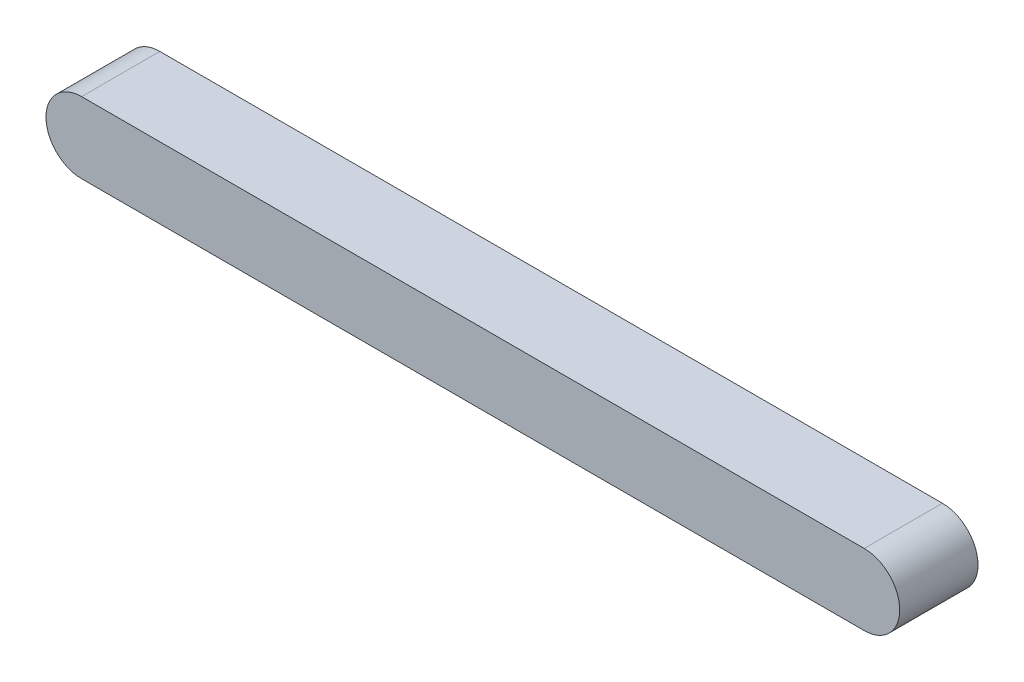
ISO-10303-21;
HEADER;
FILE_DESCRIPTION(('STEP AP214'),'2;1');
FILE_NAME('part.step','',(''),(''),'','','');
FILE_SCHEMA(('AUTOMOTIVE_DESIGN { 1 0 10303 214 1 1 1 1 }'));
ENDSEC;
DATA;
#1=APPLICATION_CONTEXT('core data for automotive mechanical design processes');
#2=APPLICATION_PROTOCOL_DEFINITION('international standard','automotive_design',2000,#1);
#3=PRODUCT_CONTEXT('',#1,'mechanical');
#4=PRODUCT('Part','Part','',(#3));
#5=PRODUCT_RELATED_PRODUCT_CATEGORY('part','',(#4));
#6=PRODUCT_DEFINITION_FORMATION('','',#4);
#7=PRODUCT_DEFINITION_CONTEXT('part definition',#1,'design');
#8=PRODUCT_DEFINITION('design','',#6,#7);
#9=PRODUCT_DEFINITION_SHAPE('','',#8);
#10=(LENGTH_UNIT() NAMED_UNIT(*) SI_UNIT(.MILLI.,.METRE.));
#11=(NAMED_UNIT(*) PLANE_ANGLE_UNIT() SI_UNIT($,.RADIAN.));
#12=(NAMED_UNIT(*) SI_UNIT($,.STERADIAN.) SOLID_ANGLE_UNIT());
#13=UNCERTAINTY_MEASURE_WITH_UNIT(LENGTH_MEASURE(1.E-05),#10,'distance_accuracy_value','');
#14=(GEOMETRIC_REPRESENTATION_CONTEXT(3) GLOBAL_UNCERTAINTY_ASSIGNED_CONTEXT((#13)) GLOBAL_UNIT_ASSIGNED_CONTEXT((#10,
#11,#12)) REPRESENTATION_CONTEXT('',''));
#15=CARTESIAN_POINT('',(0.,0.,0.));
#16=DIRECTION('',(0.,0.,1.));
#17=DIRECTION('',(1.,0.,0.));
#18=AXIS2_PLACEMENT_3D('',#15,#16,#17);
#19=CARTESIAN_POINT('',(-11.,0.,2.2));
#20=DIRECTION('',(0.,0.,-1.));
#21=DIRECTION('',(-1.,0.,0.));
#22=AXIS2_PLACEMENT_3D('',#19,#20,#21);
#23=CYLINDRICAL_SURFACE('',#22,1.);
#24=CARTESIAN_POINT('',(-11.,0.,0.));
#25=DIRECTION('',(0.,0.,1.));
#26=DIRECTION('',(1.,0.,0.));
#27=AXIS2_PLACEMENT_3D('',#24,#25,#26);
#28=CIRCLE('',#27,1.);
#29=CARTESIAN_POINT('',(-11.,1.,0.));
#30=VERTEX_POINT('',#29);
#31=CARTESIAN_POINT('',(-11.,-1.,0.));
#32=VERTEX_POINT('',#31);
#33=EDGE_CURVE('E100',#30,#32,#28,.T.);
#34=ORIENTED_EDGE('',*,*,#33,.T.);
#35=DIRECTION('',(0.,0.,-1.));
#36=VECTOR('',#35,1.);
#37=CARTESIAN_POINT('',(-11.,-1.,2.2));
#38=LINE('',#37,#36);
#39=CARTESIAN_POINT('',(-11.,-1.,2.2));
#40=VERTEX_POINT('',#39);
#41=EDGE_CURVE('E11',#40,#32,#38,.T.);
#42=ORIENTED_EDGE('',*,*,#41,.F.);
#43=CARTESIAN_POINT('',(-11.,0.,2.2));
#44=DIRECTION('',(0.,0.,1.));
#45=DIRECTION('',(1.,0.,0.));
#46=AXIS2_PLACEMENT_3D('',#43,#44,#45);
#47=CIRCLE('',#46,1.);
#48=CARTESIAN_POINT('',(-11.,1.,2.2));
#49=VERTEX_POINT('',#48);
#50=EDGE_CURVE('E88',#49,#40,#47,.T.);
#51=ORIENTED_EDGE('',*,*,#50,.F.);
#52=DIRECTION('',(0.,0.,-1.));
#53=VECTOR('',#52,1.);
#54=CARTESIAN_POINT('',(-11.,1.,2.2));
#55=LINE('',#54,#53);
#56=EDGE_CURVE('E96',#49,#30,#55,.T.);
#57=ORIENTED_EDGE('',*,*,#56,.T.);
#58=EDGE_LOOP('',(#34,#42,#51,#57));
#59=FACE_BOUND('',#58,.T.);
#60=ADVANCED_FACE('F37',(#59),#23,.T.);
#61=CARTESIAN_POINT('',(-11.,-1.,2.2));
#62=DIRECTION('',(0.,1.,0.));
#63=DIRECTION('',(0.,0.,1.));
#64=AXIS2_PLACEMENT_3D('',#61,#62,#63);
#65=PLANE('',#64);
#66=DIRECTION('',(1.,0.,0.));
#67=VECTOR('',#66,1.);
#68=CARTESIAN_POINT('',(-11.,-1.,0.));
#69=LINE('',#68,#67);
#70=CARTESIAN_POINT('',(11.,-1.,0.));
#71=VERTEX_POINT('',#70);
#72=EDGE_CURVE('E92',#32,#71,#69,.T.);
#73=ORIENTED_EDGE('',*,*,#72,.T.);
#74=DIRECTION('',(0.,0.,-1.));
#75=VECTOR('',#74,1.);
#76=CARTESIAN_POINT('',(11.,-1.,2.2));
#77=LINE('',#76,#75);
#78=CARTESIAN_POINT('',(11.,-1.,2.2));
#79=VERTEX_POINT('',#78);
#80=EDGE_CURVE('E45',#79,#71,#77,.T.);
#81=ORIENTED_EDGE('',*,*,#80,.F.);
#82=DIRECTION('',(1.,0.,0.));
#83=VECTOR('',#82,1.);
#84=CARTESIAN_POINT('',(-11.,-1.,2.2));
#85=LINE('',#84,#83);
#86=EDGE_CURVE('E83',#40,#79,#85,.T.);
#87=ORIENTED_EDGE('',*,*,#86,.F.);
#88=ORIENTED_EDGE('',*,*,#41,.T.);
#89=EDGE_LOOP('',(#73,#81,#87,#88));
#90=FACE_BOUND('',#89,.T.);
#91=ADVANCED_FACE('F91',(#90),#65,.F.);
#92=CARTESIAN_POINT('',(11.,0.,2.2));
#93=DIRECTION('',(0.,0.,-1.));
#94=DIRECTION('',(-1.,0.,0.));
#95=AXIS2_PLACEMENT_3D('',#92,#93,#94);
#96=CYLINDRICAL_SURFACE('',#95,1.);
#97=CARTESIAN_POINT('',(11.,0.,0.));
#98=DIRECTION('',(0.,0.,1.));
#99=DIRECTION('',(1.,0.,0.));
#100=AXIS2_PLACEMENT_3D('',#97,#98,#99);
#101=CIRCLE('',#100,1.);
#102=CARTESIAN_POINT('',(11.,1.,0.));
#103=VERTEX_POINT('',#102);
#104=EDGE_CURVE('E70',#71,#103,#101,.T.);
#105=ORIENTED_EDGE('',*,*,#104,.T.);
#106=DIRECTION('',(0.,0.,-1.));
#107=VECTOR('',#106,1.);
#108=CARTESIAN_POINT('',(11.,1.,2.2));
#109=LINE('',#108,#107);
#110=CARTESIAN_POINT('',(11.,1.,2.2));
#111=VERTEX_POINT('',#110);
#112=EDGE_CURVE('E93',#111,#103,#109,.T.);
#113=ORIENTED_EDGE('',*,*,#112,.F.);
#114=CARTESIAN_POINT('',(11.,0.,2.2));
#115=DIRECTION('',(0.,0.,1.));
#116=DIRECTION('',(1.,0.,0.));
#117=AXIS2_PLACEMENT_3D('',#114,#115,#116);
#118=CIRCLE('',#117,1.);
#119=EDGE_CURVE('E86',#79,#111,#118,.T.);
#120=ORIENTED_EDGE('',*,*,#119,.F.);
#121=ORIENTED_EDGE('',*,*,#80,.T.);
#122=EDGE_LOOP('',(#105,#113,#120,#121));
#123=FACE_BOUND('',#122,.T.);
#124=ADVANCED_FACE('F94',(#123),#96,.T.);
#125=CARTESIAN_POINT('',(-11.,1.,2.2));
#126=DIRECTION('',(0.,-1.,0.));
#127=DIRECTION('',(0.,0.,-1.));
#128=AXIS2_PLACEMENT_3D('',#125,#126,#127);
#129=PLANE('',#128);
#130=DIRECTION('',(-1.,0.,0.));
#131=VECTOR('',#130,1.);
#132=CARTESIAN_POINT('',(-11.,1.,0.));
#133=LINE('',#132,#131);
#134=EDGE_CURVE('E76',#103,#30,#133,.T.);
#135=ORIENTED_EDGE('',*,*,#134,.T.);
#136=ORIENTED_EDGE('',*,*,#56,.F.);
#137=DIRECTION('',(-1.,0.,0.));
#138=VECTOR('',#137,1.);
#139=CARTESIAN_POINT('',(-11.,1.,2.2));
#140=LINE('',#139,#138);
#141=EDGE_CURVE('E53',#111,#49,#140,.T.);
#142=ORIENTED_EDGE('',*,*,#141,.F.);
#143=ORIENTED_EDGE('',*,*,#112,.T.);
#144=EDGE_LOOP('',(#135,#136,#142,#143));
#145=FACE_BOUND('',#144,.T.);
#146=ADVANCED_FACE('F107',(#145),#129,.F.);
#147=CARTESIAN_POINT('',(-11.,0.,2.2));
#148=DIRECTION('',(0.,0.,1.));
#149=DIRECTION('',(1.,0.,0.));
#150=AXIS2_PLACEMENT_3D('',#147,#148,#149);
#151=PLANE('',#150);
#152=ORIENTED_EDGE('',*,*,#50,.T.);
#153=ORIENTED_EDGE('',*,*,#86,.T.);
#154=ORIENTED_EDGE('',*,*,#119,.T.);
#155=ORIENTED_EDGE('',*,*,#141,.T.);
#156=EDGE_LOOP('',(#152,#153,#154,#155));
#157=FACE_BOUND('',#156,.T.);
#158=ADVANCED_FACE('F84',(#157),#151,.T.);
#159=CARTESIAN_POINT('',(-11.,0.,0.));
#160=DIRECTION('',(0.,0.,1.));
#161=DIRECTION('',(1.,0.,0.));
#162=AXIS2_PLACEMENT_3D('',#159,#160,#161);
#163=PLANE('',#162);
#164=ORIENTED_EDGE('',*,*,#33,.F.);
#165=ORIENTED_EDGE('',*,*,#134,.F.);
#166=ORIENTED_EDGE('',*,*,#104,.F.);
#167=ORIENTED_EDGE('',*,*,#72,.F.);
#168=EDGE_LOOP('',(#164,#165,#166,#167));
#169=FACE_BOUND('',#168,.T.);
#170=ADVANCED_FACE('F110',(#169),#163,.F.);
#171=CLOSED_SHELL('',(#60,#91,#124,#146,#158,#170));
#172=MANIFOLD_SOLID_BREP('B2',#171);
#173=ADVANCED_BREP_SHAPE_REPRESENTATION('',(#18,#172),#14);
#174=SHAPE_DEFINITION_REPRESENTATION(#9,#173);
ENDSEC;
END-ISO-10303-21;
